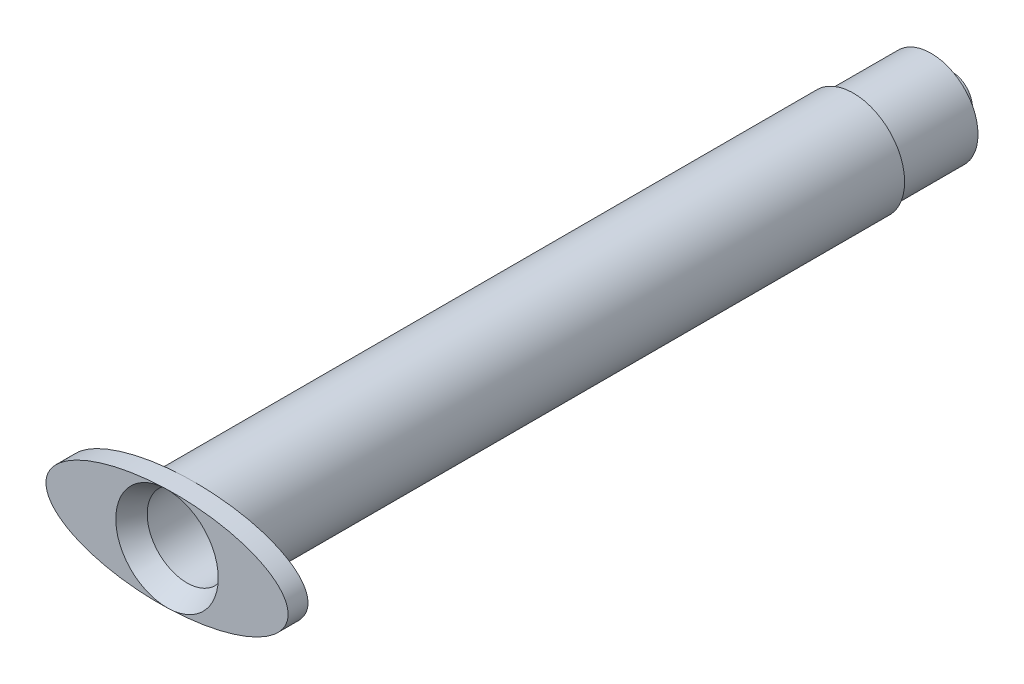
ISO-10303-21;
HEADER;
FILE_DESCRIPTION(('STEP AP214'),'2;1');
FILE_NAME('part.step','',(''),(''),'','','');
FILE_SCHEMA(('AUTOMOTIVE_DESIGN { 1 0 10303 214 1 1 1 1 }'));
ENDSEC;
DATA;
#1=APPLICATION_CONTEXT('core data for automotive mechanical design processes');
#2=APPLICATION_PROTOCOL_DEFINITION('international standard','automotive_design',2000,#1);
#3=PRODUCT_CONTEXT('',#1,'mechanical');
#4=PRODUCT('Part','Part','',(#3));
#5=PRODUCT_RELATED_PRODUCT_CATEGORY('part','',(#4));
#6=PRODUCT_DEFINITION_FORMATION('','',#4);
#7=PRODUCT_DEFINITION_CONTEXT('part definition',#1,'design');
#8=PRODUCT_DEFINITION('design','',#6,#7);
#9=PRODUCT_DEFINITION_SHAPE('','',#8);
#10=(LENGTH_UNIT() NAMED_UNIT(*) SI_UNIT(.MILLI.,.METRE.));
#11=(NAMED_UNIT(*) PLANE_ANGLE_UNIT() SI_UNIT($,.RADIAN.));
#12=(NAMED_UNIT(*) SI_UNIT($,.STERADIAN.) SOLID_ANGLE_UNIT());
#13=UNCERTAINTY_MEASURE_WITH_UNIT(LENGTH_MEASURE(1.E-05),#10,'distance_accuracy_value','');
#14=(GEOMETRIC_REPRESENTATION_CONTEXT(3) GLOBAL_UNCERTAINTY_ASSIGNED_CONTEXT((#13)) GLOBAL_UNIT_ASSIGNED_CONTEXT((#10,
#11,#12)) REPRESENTATION_CONTEXT('',''));
#15=CARTESIAN_POINT('',(0.,0.,0.));
#16=DIRECTION('',(0.,0.,1.));
#17=DIRECTION('',(1.,0.,0.));
#18=AXIS2_PLACEMENT_3D('',#15,#16,#17);
#19=CARTESIAN_POINT('',(0.,0.,-9.95));
#20=DIRECTION('',(0.,0.,-1.));
#21=DIRECTION('',(-1.,0.,0.));
#22=AXIS2_PLACEMENT_3D('',#19,#20,#21);
#23=PLANE('',#22);
#24=CARTESIAN_POINT('',(0.,0.,-9.95));
#25=DIRECTION('',(0.,0.,-1.));
#26=DIRECTION('',(-1.,0.,0.));
#27=AXIS2_PLACEMENT_3D('',#24,#25,#26);
#28=CIRCLE('',#27,2.06);
#29=CARTESIAN_POINT('',(2.06,0.,-9.95));
#30=VERTEX_POINT('',#29);
#31=EDGE_CURVE('E11',#30,#30,#28,.T.);
#32=ORIENTED_EDGE('',*,*,#31,.T.);
#33=EDGE_LOOP('',(#32));
#34=FACE_BOUND('',#33,.T.);
#35=CARTESIAN_POINT('',(0.,0.,-9.95));
#36=DIRECTION('',(0.,0.,-1.));
#37=DIRECTION('',(-1.,0.,0.));
#38=AXIS2_PLACEMENT_3D('',#35,#36,#37);
#39=CIRCLE('',#38,0.795);
#40=CARTESIAN_POINT('',(0.795,0.,-9.95));
#41=VERTEX_POINT('',#40);
#42=EDGE_CURVE('E48',#41,#41,#39,.T.);
#43=ORIENTED_EDGE('',*,*,#42,.F.);
#44=EDGE_LOOP('',(#43));
#45=FACE_BOUND('',#44,.T.);
#46=ADVANCED_FACE('F40',(#34,#45),#23,.T.);
#47=CARTESIAN_POINT('',(0.,0.,-9.95));
#48=DIRECTION('',(0.,0.,1.));
#49=DIRECTION('',(1.,0.,0.));
#50=AXIS2_PLACEMENT_3D('',#47,#48,#49);
#51=CYLINDRICAL_SURFACE('',#50,2.06);
#52=CARTESIAN_POINT('',(0.,0.,-1.15));
#53=DIRECTION('',(0.,0.,-1.));
#54=DIRECTION('',(-1.,0.,0.));
#55=AXIS2_PLACEMENT_3D('',#52,#53,#54);
#56=CIRCLE('',#55,2.06);
#57=CARTESIAN_POINT('',(2.06,0.,-1.15));
#58=VERTEX_POINT('',#57);
#59=EDGE_CURVE('E52',#58,#58,#56,.T.);
#60=CARTESIAN_POINT('',(2.06,0.,-1.15));
#61=CARTESIAN_POINT('',(2.06,0.,-1.24166666666667));
#62=CARTESIAN_POINT('',(2.06,0.,-1.33333333333333));
#63=CARTESIAN_POINT('',(2.06,0.,-1.51666666666667));
#64=CARTESIAN_POINT('',(2.06,0.,-1.60833333333333));
#65=CARTESIAN_POINT('',(2.06,0.,-1.79166666666666));
#66=CARTESIAN_POINT('',(2.06,0.,-1.88333333333333));
#67=CARTESIAN_POINT('',(2.06,0.,-2.06666666666666));
#68=CARTESIAN_POINT('',(2.06,0.,-2.15833333333333));
#69=CARTESIAN_POINT('',(2.06,0.,-2.34166666666666));
#70=CARTESIAN_POINT('',(2.06,0.,-2.43333333333333));
#71=CARTESIAN_POINT('',(2.06,0.,-2.61666666666666));
#72=CARTESIAN_POINT('',(2.06,0.,-2.70833333333333));
#73=CARTESIAN_POINT('',(2.06,0.,-2.89166666666666));
#74=CARTESIAN_POINT('',(2.06,0.,-2.98333333333333));
#75=CARTESIAN_POINT('',(2.06,0.,-3.16666666666666));
#76=CARTESIAN_POINT('',(2.06,0.,-3.25833333333333));
#77=CARTESIAN_POINT('',(2.06,0.,-3.44166666666666));
#78=CARTESIAN_POINT('',(2.06,0.,-3.53333333333333));
#79=CARTESIAN_POINT('',(2.06,0.,-3.71666666666666));
#80=CARTESIAN_POINT('',(2.06,0.,-3.80833333333333));
#81=CARTESIAN_POINT('',(2.06,0.,-3.99166666666666));
#82=CARTESIAN_POINT('',(2.06,0.,-4.08333333333333));
#83=CARTESIAN_POINT('',(2.06,0.,-4.26666666666666));
#84=CARTESIAN_POINT('',(2.06,0.,-4.35833333333333));
#85=CARTESIAN_POINT('',(2.06,0.,-4.54166666666667));
#86=CARTESIAN_POINT('',(2.06,0.,-4.63333333333333));
#87=CARTESIAN_POINT('',(2.06,0.,-4.81666666666667));
#88=CARTESIAN_POINT('',(2.06,0.,-4.90833333333333));
#89=CARTESIAN_POINT('',(2.06,0.,-5.09166666666667));
#90=CARTESIAN_POINT('',(2.06,0.,-5.18333333333333));
#91=CARTESIAN_POINT('',(2.06,0.,-5.36666666666667));
#92=CARTESIAN_POINT('',(2.06,0.,-5.45833333333333));
#93=CARTESIAN_POINT('',(2.06,0.,-5.64166666666667));
#94=CARTESIAN_POINT('',(2.06,0.,-5.73333333333333));
#95=CARTESIAN_POINT('',(2.06,0.,-5.91666666666666));
#96=CARTESIAN_POINT('',(2.06,0.,-6.00833333333333));
#97=CARTESIAN_POINT('',(2.06,0.,-6.19166666666666));
#98=CARTESIAN_POINT('',(2.06,0.,-6.28333333333333));
#99=CARTESIAN_POINT('',(2.06,0.,-6.46666666666667));
#100=CARTESIAN_POINT('',(2.06,0.,-6.55833333333333));
#101=CARTESIAN_POINT('',(2.06,0.,-6.74166666666666));
#102=CARTESIAN_POINT('',(2.06,0.,-6.83333333333333));
#103=CARTESIAN_POINT('',(2.06,0.,-7.01666666666666));
#104=CARTESIAN_POINT('',(2.06,0.,-7.10833333333333));
#105=CARTESIAN_POINT('',(2.06,0.,-7.29166666666667));
#106=CARTESIAN_POINT('',(2.06,0.,-7.38333333333333));
#107=CARTESIAN_POINT('',(2.06,0.,-7.56666666666667));
#108=CARTESIAN_POINT('',(2.06,0.,-7.65833333333333));
#109=CARTESIAN_POINT('',(2.06,0.,-7.84166666666667));
#110=CARTESIAN_POINT('',(2.06,0.,-7.93333333333333));
#111=CARTESIAN_POINT('',(2.06,0.,-8.11666666666667));
#112=CARTESIAN_POINT('',(2.06,0.,-8.20833333333333));
#113=CARTESIAN_POINT('',(2.06,0.,-8.39166666666667));
#114=CARTESIAN_POINT('',(2.06,0.,-8.48333333333333));
#115=CARTESIAN_POINT('',(2.06,0.,-8.66666666666667));
#116=CARTESIAN_POINT('',(2.06,0.,-8.75833333333333));
#117=CARTESIAN_POINT('',(2.06,0.,-8.94166666666666));
#118=CARTESIAN_POINT('',(2.06,0.,-9.03333333333333));
#119=CARTESIAN_POINT('',(2.06,0.,-9.21666666666667));
#120=CARTESIAN_POINT('',(2.06,0.,-9.30833333333333));
#121=CARTESIAN_POINT('',(2.06,0.,-9.49166666666667));
#122=CARTESIAN_POINT('',(2.06,0.,-9.58333333333333));
#123=CARTESIAN_POINT('',(2.06,0.,-9.76666666666666));
#124=CARTESIAN_POINT('',(2.06,0.,-9.85833333333333));
#125=CARTESIAN_POINT('',(2.06,0.,-9.95));
#126=B_SPLINE_CURVE_WITH_KNOTS('',3,(#60,#61,#62,#63,#64,#65,#66,#67,#68,#69,#70,#71,#72,#73,
#74,#75,#76,#77,#78,#79,#80,#81,#82,#83,#84,#85,#86,#87,#88,#89,#90,#91,#92,#93,#94,#95,#96,#97,
#98,#99,#100,#101,#102,#103,#104,#105,#106,#107,#108,#109,#110,#111,#112,#113,#114,#115,#116,
#117,#118,#119,#120,#121,#122,#123,#124,#125),.UNSPECIFIED.,.F.,.F.,(4,2,2,2,2,2,2,2,2,2,2,2,2,
2,2,2,2,2,2,2,2,2,2,2,2,2,2,2,2,2,2,2,4),(0.,0.275000000000001,0.55,0.824999999999999,1.1,1.375,
1.65,1.925,2.2,2.475,2.75,3.025,3.3,3.575,3.85,4.125,4.4,4.675,4.95,5.225,5.5,5.775,6.05,6.325,
6.6,6.875,7.15,7.425,7.7,7.975,8.25,8.525,8.8),.UNSPECIFIED.);
#127=EDGE_CURVE('BSEAM42',#58,#30,#126,.T.);
#128=ORIENTED_EDGE('',*,*,#59,.T.);
#129=ORIENTED_EDGE('',*,*,#31,.F.);
#130=ORIENTED_EDGE('',*,*,#127,.T.);
#131=ORIENTED_EDGE('',*,*,#127,.F.);
#132=EDGE_LOOP('',(#128,#130,#129,#131));
#133=FACE_BOUND('',#132,.T.);
#134=ADVANCED_FACE('F42',(#133),#51,.T.);
#135=CARTESIAN_POINT('',(0.,0.,-9.95));
#136=DIRECTION('',(0.,0.,1.));
#137=DIRECTION('',(1.,0.,0.));
#138=AXIS2_PLACEMENT_3D('',#135,#136,#137);
#139=CYLINDRICAL_SURFACE('',#138,0.795);
#140=CARTESIAN_POINT('',(0.,0.,0.));
#141=DIRECTION('',(0.,0.,-1.));
#142=DIRECTION('',(-1.,0.,0.));
#143=AXIS2_PLACEMENT_3D('',#140,#141,#142);
#144=CIRCLE('',#143,0.795);
#145=CARTESIAN_POINT('',(0.795,0.,0.));
#146=VERTEX_POINT('',#145);
#147=EDGE_CURVE('E44',#146,#146,#144,.T.);
#148=CARTESIAN_POINT('',(0.795,0.,-9.95));
#149=CARTESIAN_POINT('',(0.795,0.,-9.84635416666666));
#150=CARTESIAN_POINT('',(0.795,0.,-9.74270833333333));
#151=CARTESIAN_POINT('',(0.795,0.,-9.53541666666666));
#152=CARTESIAN_POINT('',(0.795,0.,-9.43177083333333));
#153=CARTESIAN_POINT('',(0.795,0.,-9.22447916666666));
#154=CARTESIAN_POINT('',(0.795,0.,-9.12083333333333));
#155=CARTESIAN_POINT('',(0.795,0.,-8.91354166666667));
#156=CARTESIAN_POINT('',(0.795,0.,-8.80989583333333));
#157=CARTESIAN_POINT('',(0.795,0.,-8.60260416666666));
#158=CARTESIAN_POINT('',(0.795,0.,-8.49895833333333));
#159=CARTESIAN_POINT('',(0.795,0.,-8.29166666666666));
#160=CARTESIAN_POINT('',(0.795,0.,-8.18802083333333));
#161=CARTESIAN_POINT('',(0.795,0.,-7.98072916666666));
#162=CARTESIAN_POINT('',(0.795,0.,-7.87708333333333));
#163=CARTESIAN_POINT('',(0.795,0.,-7.66979166666667));
#164=CARTESIAN_POINT('',(0.795,0.,-7.56614583333333));
#165=CARTESIAN_POINT('',(0.795,0.,-7.35885416666667));
#166=CARTESIAN_POINT('',(0.795,0.,-7.25520833333333));
#167=CARTESIAN_POINT('',(0.795,0.,-7.04791666666666));
#168=CARTESIAN_POINT('',(0.795,0.,-6.94427083333333));
#169=CARTESIAN_POINT('',(0.795,0.,-6.73697916666666));
#170=CARTESIAN_POINT('',(0.795,0.,-6.63333333333333));
#171=CARTESIAN_POINT('',(0.795,0.,-6.42604166666666));
#172=CARTESIAN_POINT('',(0.795,0.,-6.32239583333333));
#173=CARTESIAN_POINT('',(0.795,0.,-6.11510416666667));
#174=CARTESIAN_POINT('',(0.795,0.,-6.01145833333333));
#175=CARTESIAN_POINT('',(0.795,0.,-5.80416666666667));
#176=CARTESIAN_POINT('',(0.795,0.,-5.70052083333333));
#177=CARTESIAN_POINT('',(0.795,0.,-5.49322916666667));
#178=CARTESIAN_POINT('',(0.795,0.,-5.38958333333333));
#179=CARTESIAN_POINT('',(0.795,0.,-5.18229166666667));
#180=CARTESIAN_POINT('',(0.795,0.,-5.07864583333333));
#181=CARTESIAN_POINT('',(0.795,0.,-4.87135416666667));
#182=CARTESIAN_POINT('',(0.795,0.,-4.76770833333333));
#183=CARTESIAN_POINT('',(0.795,0.,-4.56041666666667));
#184=CARTESIAN_POINT('',(0.795,0.,-4.45677083333333));
#185=CARTESIAN_POINT('',(0.795,0.,-4.24947916666667));
#186=CARTESIAN_POINT('',(0.795,0.,-4.14583333333333));
#187=CARTESIAN_POINT('',(0.795,0.,-3.93854166666667));
#188=CARTESIAN_POINT('',(0.795,0.,-3.83489583333333));
#189=CARTESIAN_POINT('',(0.795,0.,-3.62760416666666));
#190=CARTESIAN_POINT('',(0.795,0.,-3.52395833333333));
#191=CARTESIAN_POINT('',(0.795,0.,-3.31666666666666));
#192=CARTESIAN_POINT('',(0.795,0.,-3.21302083333333));
#193=CARTESIAN_POINT('',(0.795,0.,-3.00572916666667));
#194=CARTESIAN_POINT('',(0.795,0.,-2.90208333333333));
#195=CARTESIAN_POINT('',(0.795,0.,-2.69479166666667));
#196=CARTESIAN_POINT('',(0.795,0.,-2.59114583333333));
#197=CARTESIAN_POINT('',(0.795,0.,-2.38385416666666));
#198=CARTESIAN_POINT('',(0.795,0.,-2.28020833333333));
#199=CARTESIAN_POINT('',(0.795,0.,-2.07291666666667));
#200=CARTESIAN_POINT('',(0.795,0.,-1.96927083333333));
#201=CARTESIAN_POINT('',(0.795,0.,-1.76197916666667));
#202=CARTESIAN_POINT('',(0.795,0.,-1.65833333333333));
#203=CARTESIAN_POINT('',(0.795,0.,-1.45104166666667));
#204=CARTESIAN_POINT('',(0.795,0.,-1.34739583333333));
#205=CARTESIAN_POINT('',(0.795,0.,-1.14010416666667));
#206=CARTESIAN_POINT('',(0.795,0.,-1.03645833333333));
#207=CARTESIAN_POINT('',(0.795,0.,-0.829166666666667));
#208=CARTESIAN_POINT('',(0.795,0.,-0.725520833333334));
#209=CARTESIAN_POINT('',(0.795,0.,-0.518229166666667));
#210=CARTESIAN_POINT('',(0.795,0.,-0.414583333333334));
#211=CARTESIAN_POINT('',(0.795,0.,-0.207291666666667));
#212=CARTESIAN_POINT('',(0.795,0.,-0.103645833333333));
#213=CARTESIAN_POINT('',(0.795,0.,0.));
#214=B_SPLINE_CURVE_WITH_KNOTS('',3,(#148,#149,#150,#151,#152,#153,#154,#155,#156,#157,#158,
#159,#160,#161,#162,#163,#164,#165,#166,#167,#168,#169,#170,#171,#172,#173,#174,#175,#176,#177,
#178,#179,#180,#181,#182,#183,#184,#185,#186,#187,#188,#189,#190,#191,#192,#193,#194,#195,#196,
#197,#198,#199,#200,#201,#202,#203,#204,#205,#206,#207,#208,#209,#210,#211,#212,#213),
.UNSPECIFIED.,.F.,.F.,(4,2,2,2,2,2,2,2,2,2,2,2,2,2,2,2,2,2,2,2,2,2,2,2,2,2,2,2,2,2,2,2,4),(0.,
0.3109375,0.621875000000001,0.932812500000001,1.24375,1.5546875,1.865625,2.1765625,2.4875,
2.7984375,3.109375,3.4203125,3.73125,4.0421875,4.353125,4.6640625,4.975,5.2859375,5.596875,
5.9078125,6.21875,6.5296875,6.840625,7.1515625,7.4625,7.7734375,8.084375,8.3953125,8.70625,
9.0171875,9.328125,9.6390625,9.95),.UNSPECIFIED.);
#215=EDGE_CURVE('BSEAM84',#41,#146,#214,.T.);
#216=ORIENTED_EDGE('',*,*,#42,.T.);
#217=ORIENTED_EDGE('',*,*,#147,.F.);
#218=ORIENTED_EDGE('',*,*,#215,.T.);
#219=ORIENTED_EDGE('',*,*,#215,.F.);
#220=EDGE_LOOP('',(#216,#218,#217,#219));
#221=FACE_BOUND('',#220,.T.);
#222=ADVANCED_FACE('F84',(#221),#139,.F.);
#223=CARTESIAN_POINT('',(0.,0.,-1.15));
#224=DIRECTION('',(0.,0.,-1.));
#225=DIRECTION('',(-1.,0.,0.));
#226=AXIS2_PLACEMENT_3D('',#223,#224,#225);
#227=PLANE('',#226);
#228=CARTESIAN_POINT('',(0.,0.,-1.15));
#229=DIRECTION('',(0.,0.,-1.));
#230=DIRECTION('',(-1.,0.,0.));
#231=AXIS2_PLACEMENT_3D('',#228,#229,#230);
#232=CIRCLE('',#231,4.0952596);
#233=CARTESIAN_POINT('',(-4.0952596,0.,-1.15));
#234=VERTEX_POINT('',#233);
#235=EDGE_CURVE('E57',#234,#234,#232,.T.);
#236=ORIENTED_EDGE('',*,*,#235,.T.);
#237=EDGE_LOOP('',(#236));
#238=FACE_BOUND('',#237,.T.);
#239=ORIENTED_EDGE('',*,*,#59,.F.);
#240=EDGE_LOOP('',(#239));
#241=FACE_BOUND('',#240,.T.);
#242=ADVANCED_FACE('F64',(#238,#241),#227,.T.);
#243=CARTESIAN_POINT('',(0.,0.,-1.15));
#244=DIRECTION('',(0.,0.,1.));
#245=DIRECTION('',(1.,0.,0.));
#246=AXIS2_PLACEMENT_3D('',#243,#244,#245);
#247=CYLINDRICAL_SURFACE('',#246,4.0952596);
#248=ORIENTED_EDGE('',*,*,#235,.F.);
#249=EDGE_LOOP('',(#248));
#250=FACE_BOUND('',#249,.T.);
#251=CARTESIAN_POINT('',(0.,0.,0.));
#252=DIRECTION('',(0.,0.,-1.));
#253=DIRECTION('',(-1.,0.,0.));
#254=AXIS2_PLACEMENT_3D('',#251,#252,#253);
#255=CIRCLE('',#254,4.0952596);
#256=CARTESIAN_POINT('',(-4.0952596,0.,0.));
#257=VERTEX_POINT('',#256);
#258=EDGE_CURVE('E58',#257,#257,#255,.T.);
#259=ORIENTED_EDGE('',*,*,#258,.T.);
#260=EDGE_LOOP('',(#259));
#261=FACE_BOUND('',#260,.T.);
#262=ADVANCED_FACE('F67',(#250,#261),#247,.T.);
#263=CARTESIAN_POINT('',(0.,0.,0.));
#264=DIRECTION('',(0.,0.,-1.));
#265=DIRECTION('',(-1.,0.,0.));
#266=AXIS2_PLACEMENT_3D('',#263,#264,#265);
#267=PLANE('',#266);
#268=ORIENTED_EDGE('',*,*,#147,.T.);
#269=EDGE_LOOP('',(#268));
#270=FACE_BOUND('',#269,.T.);
#271=ORIENTED_EDGE('',*,*,#258,.F.);
#272=EDGE_LOOP('',(#271));
#273=FACE_BOUND('',#272,.T.);
#274=ADVANCED_FACE('F70',(#270,#273),#267,.F.);
#275=CLOSED_SHELL('',(#46,#134,#222,#242,#262,#274));
#276=MANIFOLD_SOLID_BREP('B2',#275);
#277=CARTESIAN_POINT('',(0.,0.,0.));
#278=DIRECTION('',(0.,0.,1.));
#279=DIRECTION('',(1.,0.,0.));
#280=AXIS2_PLACEMENT_3D('',#277,#278,#279);
#281=PLANE('',#280);
#282=CARTESIAN_POINT('',(0.,0.,0.));
#283=DIRECTION('',(0.,0.,1.));
#284=DIRECTION('',(1.,0.,0.));
#285=AXIS2_PLACEMENT_3D('',#282,#283,#284);
#286=CIRCLE('',#285,5.17);
#287=CARTESIAN_POINT('',(5.17,0.,0.));
#288=VERTEX_POINT('',#287);
#289=EDGE_CURVE('E216',#288,#288,#286,.T.);
#290=ORIENTED_EDGE('',*,*,#289,.F.);
#291=EDGE_LOOP('',(#290));
#292=FACE_BOUND('',#291,.T.);
#293=CARTESIAN_POINT('',(0.,0.,0.));
#294=DIRECTION('',(0.,0.,1.));
#295=DIRECTION('',(1.,0.,0.));
#296=AXIS2_PLACEMENT_3D('',#293,#294,#295);
#297=CIRCLE('',#296,4.725);
#298=CARTESIAN_POINT('',(4.725,0.,0.));
#299=VERTEX_POINT('',#298);
#300=EDGE_CURVE('E38',#299,#299,#297,.F.);
#301=ORIENTED_EDGE('',*,*,#300,.F.);
#302=EDGE_LOOP('',(#301));
#303=FACE_BOUND('',#302,.T.);
#304=ADVANCED_FACE('F137',(#292,#303),#281,.F.);
#305=CARTESIAN_POINT('',(0.,0.,69.26));
#306=DIRECTION('',(0.,0.,1.));
#307=DIRECTION('',(1.,0.,0.));
#308=AXIS2_PLACEMENT_3D('',#305,#306,#307);
#309=PLANE('',#308);
#310=CARTESIAN_POINT('',(0.,0.,69.26));
#311=DIRECTION('',(0.,0.,1.));
#312=DIRECTION('',(1.,0.,0.));
#313=AXIS2_PLACEMENT_3D('',#310,#311,#312);
#314=CIRCLE('',#313,5.17);
#315=CARTESIAN_POINT('',(-0.182263931129008,5.16678622157037,69.26));
#316=VERTEX_POINT('',#315);
#317=CARTESIAN_POINT('',(0.182263931129008,-5.16678622157037,69.26));
#318=VERTEX_POINT('',#317);
#319=EDGE_CURVE('E151',#316,#318,#314,.T.);
#320=ORIENTED_EDGE('',*,*,#319,.F.);
#321=CARTESIAN_POINT('',(0.,0.,69.26));
#322=DIRECTION('',(0.,0.,1.));
#323=DIRECTION('',(-0.999378379413998,-0.035254145286075,0.));
#324=AXIS2_PLACEMENT_3D('',#321,#322,#323);
#325=ELLIPSE('',#324,12.22,5.17);
#326=EDGE_CURVE('E171',#316,#318,#325,.T.);
#327=ORIENTED_EDGE('',*,*,#326,.T.);
#328=EDGE_LOOP('',(#320,#327));
#329=FACE_BOUND('',#328,.T.);
#330=ADVANCED_FACE('F170',(#329),#309,.T.);
#331=CARTESIAN_POINT('',(0.,0.,0.));
#332=DIRECTION('',(0.,0.,-1.));
#333=DIRECTION('',(-1.,0.,0.));
#334=AXIS2_PLACEMENT_3D('',#331,#332,#333);
#335=CIRCLE('',#334,4.11);
#336=CARTESIAN_POINT('',(-4.11,0.,0.));
#337=VERTEX_POINT('',#336);
#338=EDGE_CURVE('E343',#337,#337,#335,.T.);
#339=ORIENTED_EDGE('',*,*,#338,.T.);
#340=EDGE_LOOP('',(#339));
#341=FACE_BOUND('',#340,.T.);
#342=CARTESIAN_POINT('',(0.,0.,0.));
#343=DIRECTION('',(0.,0.,1.));
#344=DIRECTION('',(1.,0.,0.));
#345=AXIS2_PLACEMENT_3D('',#342,#343,#344);
#346=CIRCLE('',#345,4.1);
#347=CARTESIAN_POINT('',(4.1,0.,0.));
#348=VERTEX_POINT('',#347);
#349=EDGE_CURVE('E185',#348,#348,#346,.T.);
#350=ORIENTED_EDGE('',*,*,#349,.T.);
#351=EDGE_LOOP('',(#350));
#352=FACE_BOUND('',#351,.T.);
#353=ADVANCED_FACE('F200',(#341,#352),#281,.F.);
#354=CARTESIAN_POINT('',(0.,0.,67.25));
#355=DIRECTION('',(0.,0.,-1.));
#356=DIRECTION('',(-1.,0.,0.));
#357=AXIS2_PLACEMENT_3D('',#354,#355,#356);
#358=CYLINDRICAL_SURFACE('',#357,5.17);
#359=CARTESIAN_POINT('',(0.,0.,67.25));
#360=DIRECTION('',(0.,0.,1.));
#361=DIRECTION('',(1.,0.,0.));
#362=AXIS2_PLACEMENT_3D('',#359,#360,#361);
#363=CIRCLE('',#362,5.17);
#364=CARTESIAN_POINT('',(-0.182263931129006,5.16678622157037,67.25));
#365=VERTEX_POINT('',#364);
#366=CARTESIAN_POINT('',(0.182263931129008,-5.16678622157037,67.25));
#367=VERTEX_POINT('',#366);
#368=EDGE_CURVE('E167',#365,#367,#363,.T.);
#369=ORIENTED_EDGE('',*,*,#368,.F.);
#370=EDGE_CURVE('E158',#367,#365,#363,.T.);
#371=ORIENTED_EDGE('',*,*,#370,.F.);
#372=EDGE_LOOP('',(#369,#371));
#373=FACE_BOUND('',#372,.T.);
#374=ORIENTED_EDGE('',*,*,#289,.T.);
#375=EDGE_LOOP('',(#374));
#376=FACE_BOUND('',#375,.T.);
#377=ADVANCED_FACE('F139',(#373,#376),#358,.T.);
#378=CARTESIAN_POINT('',(0.,0.,67.25));
#379=DIRECTION('',(0.,0.,-1.));
#380=DIRECTION('',(-1.,0.,0.));
#381=AXIS2_PLACEMENT_3D('',#378,#379,#380);
#382=CYLINDRICAL_SURFACE('',#381,4.1);
#383=CARTESIAN_POINT('',(0.,0.,67.25));
#384=DIRECTION('',(0.,0.,1.));
#385=DIRECTION('',(1.,0.,0.));
#386=AXIS2_PLACEMENT_3D('',#383,#384,#385);
#387=CIRCLE('',#386,4.1);
#388=CARTESIAN_POINT('',(4.1,0.,67.25));
#389=VERTEX_POINT('',#388);
#390=EDGE_CURVE('E183',#389,#389,#387,.T.);
#391=ORIENTED_EDGE('',*,*,#390,.T.);
#392=EDGE_LOOP('',(#391));
#393=FACE_BOUND('',#392,.T.);
#394=ORIENTED_EDGE('',*,*,#349,.F.);
#395=EDGE_LOOP('',(#394));
#396=FACE_BOUND('',#395,.T.);
#397=ADVANCED_FACE('F197',(#393,#396),#382,.F.);
#398=CARTESIAN_POINT('',(0.,0.,67.25));
#399=DIRECTION('',(0.,0.,1.));
#400=DIRECTION('',(1.,0.,0.));
#401=AXIS2_PLACEMENT_3D('',#398,#399,#400);
#402=PLANE('',#401);
#403=CARTESIAN_POINT('',(0.,0.,67.25));
#404=DIRECTION('',(0.,0.,1.));
#405=DIRECTION('',(1.,0.,0.));
#406=AXIS2_PLACEMENT_3D('',#403,#404,#405);
#407=CIRCLE('',#406,4.00952595892885);
#408=CARTESIAN_POINT('',(4.00952595892885,0.,67.25));
#409=VERTEX_POINT('',#408);
#410=EDGE_CURVE('E173',#409,#409,#407,.T.);
#411=ORIENTED_EDGE('',*,*,#410,.T.);
#412=EDGE_LOOP('',(#411));
#413=FACE_BOUND('',#412,.T.);
#414=ORIENTED_EDGE('',*,*,#390,.F.);
#415=EDGE_LOOP('',(#414));
#416=FACE_BOUND('',#415,.T.);
#417=ADVANCED_FACE('F195',(#413,#416),#402,.F.);
#418=CARTESIAN_POINT('',(0.,0.,67.25));
#419=DIRECTION('',(0.,0.,1.));
#420=DIRECTION('',(-0.999378379413998,-0.035254145286075,0.));
#421=AXIS2_PLACEMENT_3D('',#418,#419,#420);
#422=ELLIPSE('',#421,12.22,5.17);
#423=EDGE_CURVE('E336',#365,#367,#422,.T.);
#424=ORIENTED_EDGE('',*,*,#423,.F.);
#425=ORIENTED_EDGE('',*,*,#368,.T.);
#426=EDGE_LOOP('',(#424,#425));
#427=FACE_BOUND('',#426,.T.);
#428=ADVANCED_FACE('F293',(#427),#402,.F.);
#429=EDGE_CURVE('E180',#367,#365,#422,.T.);
#430=ORIENTED_EDGE('',*,*,#429,.F.);
#431=ORIENTED_EDGE('',*,*,#370,.T.);
#432=EDGE_LOOP('',(#430,#431));
#433=FACE_BOUND('',#432,.T.);
#434=ADVANCED_FACE('F194',(#433),#402,.F.);
#435=DIRECTION('',(0.,0.,-1.));
#436=VECTOR('',#435,1.);
#437=SURFACE_OF_LINEAR_EXTRUSION('',#325,#436);
#438=EDGE_CURVE('E179',#318,#316,#325,.T.);
#439=ORIENTED_EDGE('',*,*,#438,.F.);
#440=ORIENTED_EDGE('',*,*,#326,.F.);
#441=EDGE_LOOP('',(#439,#440));
#442=FACE_BOUND('',#441,.T.);
#443=ORIENTED_EDGE('',*,*,#429,.T.);
#444=ORIENTED_EDGE('',*,*,#423,.T.);
#445=EDGE_LOOP('',(#443,#444));
#446=FACE_BOUND('',#445,.T.);
#447=ADVANCED_FACE('F177',(#442,#446),#437,.F.);
#448=CARTESIAN_POINT('',(0.,0.,69.26));
#449=DIRECTION('',(0.,0.,1.));
#450=DIRECTION('',(1.,0.,0.));
#451=AXIS2_PLACEMENT_3D('',#448,#449,#450);
#452=CIRCLE('',#451,5.17);
#453=EDGE_CURVE('E145',#318,#316,#452,.T.);
#454=ORIENTED_EDGE('',*,*,#453,.F.);
#455=ORIENTED_EDGE('',*,*,#438,.T.);
#456=EDGE_LOOP('',(#454,#455));
#457=FACE_BOUND('',#456,.T.);
#458=ADVANCED_FACE('F182',(#457),#309,.T.);
#459=CARTESIAN_POINT('',(0.,0.,69.26));
#460=DIRECTION('',(0.,0.,1.));
#461=DIRECTION('',(1.,0.,0.));
#462=AXIS2_PLACEMENT_3D('',#459,#460,#461);
#463=CONICAL_SURFACE('',#462,5.17,0.5235987755983);
#464=ORIENTED_EDGE('',*,*,#410,.F.);
#465=EDGE_LOOP('',(#464));
#466=FACE_BOUND('',#465,.T.);
#467=ORIENTED_EDGE('',*,*,#319,.T.);
#468=ORIENTED_EDGE('',*,*,#453,.T.);
#469=EDGE_LOOP('',(#467,#468));
#470=FACE_BOUND('',#469,.T.);
#471=ADVANCED_FACE('F163',(#466,#470),#463,.F.);
#472=CARTESIAN_POINT('',(0.,0.,-7.85));
#473=DIRECTION('',(0.,0.,-1.));
#474=DIRECTION('',(-1.,0.,0.));
#475=AXIS2_PLACEMENT_3D('',#472,#473,#474);
#476=PLANE('',#475);
#477=CARTESIAN_POINT('',(0.,0.,-7.85));
#478=DIRECTION('',(0.,0.,-1.));
#479=DIRECTION('',(-1.,0.,0.));
#480=AXIS2_PLACEMENT_3D('',#477,#478,#479);
#481=CIRCLE('',#480,4.725);
#482=CARTESIAN_POINT('',(-4.725,0.,-7.85));
#483=VERTEX_POINT('',#482);
#484=EDGE_CURVE('E174',#483,#483,#481,.T.);
#485=ORIENTED_EDGE('',*,*,#484,.T.);
#486=EDGE_LOOP('',(#485));
#487=FACE_BOUND('',#486,.T.);
#488=CARTESIAN_POINT('',(0.,0.,-7.85));
#489=DIRECTION('',(0.,0.,-1.));
#490=DIRECTION('',(-1.,0.,0.));
#491=AXIS2_PLACEMENT_3D('',#488,#489,#490);
#492=CIRCLE('',#491,4.11);
#493=CARTESIAN_POINT('',(-4.11,0.,-7.85));
#494=VERTEX_POINT('',#493);
#495=EDGE_CURVE('E340',#494,#494,#492,.T.);
#496=ORIENTED_EDGE('',*,*,#495,.F.);
#497=EDGE_LOOP('',(#496));
#498=FACE_BOUND('',#497,.T.);
#499=ADVANCED_FACE('F222',(#487,#498),#476,.T.);
#500=CARTESIAN_POINT('',(0.,0.,-7.85));
#501=DIRECTION('',(0.,0.,1.));
#502=DIRECTION('',(1.,0.,0.));
#503=AXIS2_PLACEMENT_3D('',#500,#501,#502);
#504=CYLINDRICAL_SURFACE('',#503,4.725);
#505=ORIENTED_EDGE('',*,*,#484,.F.);
#506=EDGE_LOOP('',(#505));
#507=FACE_BOUND('',#506,.T.);
#508=ORIENTED_EDGE('',*,*,#300,.T.);
#509=EDGE_LOOP('',(#508));
#510=FACE_BOUND('',#509,.T.);
#511=ADVANCED_FACE('F219',(#507,#510),#504,.T.);
#512=CARTESIAN_POINT('',(0.,0.,-7.85));
#513=DIRECTION('',(0.,0.,1.));
#514=DIRECTION('',(1.,0.,0.));
#515=AXIS2_PLACEMENT_3D('',#512,#513,#514);
#516=CYLINDRICAL_SURFACE('',#515,4.11);
#517=ORIENTED_EDGE('',*,*,#495,.T.);
#518=EDGE_LOOP('',(#517));
#519=FACE_BOUND('',#518,.T.);
#520=ORIENTED_EDGE('',*,*,#338,.F.);
#521=EDGE_LOOP('',(#520));
#522=FACE_BOUND('',#521,.T.);
#523=ADVANCED_FACE('F221',(#519,#522),#516,.F.);
#524=CLOSED_SHELL('',(#304,#330,#353,#377,#397,#417,#428,#434,#447,#458,#471,#499,#511,#523));
#525=MANIFOLD_SOLID_BREP('B6',#524);
#526=ADVANCED_BREP_SHAPE_REPRESENTATION('',(#18,#276,#525),#14);
#527=SHAPE_DEFINITION_REPRESENTATION(#9,#526);
ENDSEC;
END-ISO-10303-21;
